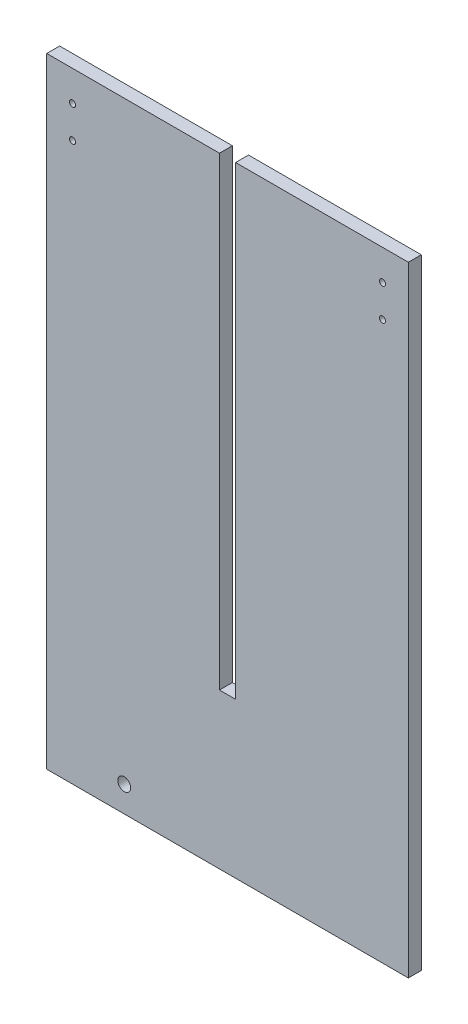
ISO-10303-21;
HEADER;
FILE_DESCRIPTION(('STEP AP214'),'2;1');
FILE_NAME('part.step','',(''),(''),'','','');
FILE_SCHEMA(('AUTOMOTIVE_DESIGN { 1 0 10303 214 1 1 1 1 }'));
ENDSEC;
DATA;
#1=APPLICATION_CONTEXT('core data for automotive mechanical design processes');
#2=APPLICATION_PROTOCOL_DEFINITION('international standard','automotive_design',2000,#1);
#3=PRODUCT_CONTEXT('',#1,'mechanical');
#4=PRODUCT('Part','Part','',(#3));
#5=PRODUCT_RELATED_PRODUCT_CATEGORY('part','',(#4));
#6=PRODUCT_DEFINITION_FORMATION('','',#4);
#7=PRODUCT_DEFINITION_CONTEXT('part definition',#1,'design');
#8=PRODUCT_DEFINITION('design','',#6,#7);
#9=PRODUCT_DEFINITION_SHAPE('','',#8);
#10=(LENGTH_UNIT() NAMED_UNIT(*) SI_UNIT(.MILLI.,.METRE.));
#11=(NAMED_UNIT(*) PLANE_ANGLE_UNIT() SI_UNIT($,.RADIAN.));
#12=(NAMED_UNIT(*) SI_UNIT($,.STERADIAN.) SOLID_ANGLE_UNIT());
#13=UNCERTAINTY_MEASURE_WITH_UNIT(LENGTH_MEASURE(1.E-05),#10,'distance_accuracy_value','');
#14=(GEOMETRIC_REPRESENTATION_CONTEXT(3) GLOBAL_UNCERTAINTY_ASSIGNED_CONTEXT((#13)) GLOBAL_UNIT_ASSIGNED_CONTEXT((#10,
#11,#12)) REPRESENTATION_CONTEXT('',''));
#15=CARTESIAN_POINT('',(0.,0.,0.));
#16=DIRECTION('',(0.,0.,1.));
#17=DIRECTION('',(1.,0.,0.));
#18=AXIS2_PLACEMENT_3D('',#15,#16,#17);
#19=CARTESIAN_POINT('',(0.,152.4,6.35));
#20=DIRECTION('',(0.,1.,0.));
#21=DIRECTION('',(0.,0.,1.));
#22=AXIS2_PLACEMENT_3D('',#19,#20,#21);
#23=PLANE('',#22);
#24=DIRECTION('',(0.,0.,1.));
#25=VECTOR('',#24,1.);
#26=CARTESIAN_POINT('',(-3.96875000000001,152.4,0.));
#27=LINE('',#26,#25);
#28=CARTESIAN_POINT('',(-3.96875000000001,152.4,0.));
#29=VERTEX_POINT('',#28);
#30=CARTESIAN_POINT('',(-3.96875000000001,152.4,6.35));
#31=VERTEX_POINT('',#30);
#32=EDGE_CURVE('E202',#29,#31,#27,.T.);
#33=ORIENTED_EDGE('',*,*,#32,.F.);
#34=DIRECTION('',(1.,0.,0.));
#35=VECTOR('',#34,1.);
#36=CARTESIAN_POINT('',(0.,152.4,0.));
#37=LINE('',#36,#35);
#38=CARTESIAN_POINT('',(-88.9,152.4,0.));
#39=VERTEX_POINT('',#38);
#40=EDGE_CURVE('E225',#39,#29,#37,.T.);
#41=ORIENTED_EDGE('',*,*,#40,.F.);
#42=DIRECTION('',(0.,0.,-1.));
#43=VECTOR('',#42,1.);
#44=CARTESIAN_POINT('',(-88.9,152.4,6.35));
#45=LINE('',#44,#43);
#46=CARTESIAN_POINT('',(-88.9,152.4,6.35));
#47=VERTEX_POINT('',#46);
#48=EDGE_CURVE('E52',#47,#39,#45,.T.);
#49=ORIENTED_EDGE('',*,*,#48,.F.);
#50=DIRECTION('',(1.,0.,0.));
#51=VECTOR('',#50,1.);
#52=CARTESIAN_POINT('',(0.,152.4,6.35));
#53=LINE('',#52,#51);
#54=EDGE_CURVE('E117',#47,#31,#53,.T.);
#55=ORIENTED_EDGE('',*,*,#54,.T.);
#56=EDGE_LOOP('',(#33,#41,#49,#55));
#57=FACE_BOUND('',#56,.T.);
#58=ADVANCED_FACE('F43',(#57),#23,.T.);
#59=CARTESIAN_POINT('',(88.9,0.,6.35));
#60=DIRECTION('',(1.,0.,0.));
#61=DIRECTION('',(0.,0.,-1.));
#62=AXIS2_PLACEMENT_3D('',#59,#60,#61);
#63=PLANE('',#62);
#64=DIRECTION('',(0.,-1.,0.));
#65=VECTOR('',#64,1.);
#66=CARTESIAN_POINT('',(88.9,0.,0.));
#67=LINE('',#66,#65);
#68=CARTESIAN_POINT('',(88.9,152.4,0.));
#69=VERTEX_POINT('',#68);
#70=CARTESIAN_POINT('',(88.9000000000028,-152.4,0.));
#71=VERTEX_POINT('',#70);
#72=EDGE_CURVE('E205',#69,#71,#67,.T.);
#73=ORIENTED_EDGE('',*,*,#72,.F.);
#74=DIRECTION('',(0.,0.,-1.));
#75=VECTOR('',#74,1.);
#76=CARTESIAN_POINT('',(88.9,152.4,6.35));
#77=LINE('',#76,#75);
#78=CARTESIAN_POINT('',(88.9,152.4,6.35));
#79=VERTEX_POINT('',#78);
#80=EDGE_CURVE('E11',#79,#69,#77,.T.);
#81=ORIENTED_EDGE('',*,*,#80,.F.);
#82=DIRECTION('',(0.,-1.,0.));
#83=VECTOR('',#82,1.);
#84=CARTESIAN_POINT('',(88.9,0.,6.35));
#85=LINE('',#84,#83);
#86=CARTESIAN_POINT('',(88.9000000000028,-152.4,6.34999999999999));
#87=VERTEX_POINT('',#86);
#88=EDGE_CURVE('E131',#79,#87,#85,.T.);
#89=ORIENTED_EDGE('',*,*,#88,.T.);
#90=DIRECTION('',(0.,0.,-1.));
#91=VECTOR('',#90,1.);
#92=CARTESIAN_POINT('',(88.9000000000028,-152.4,228.690695780147));
#93=LINE('',#92,#91);
#94=EDGE_CURVE('E128',#87,#71,#93,.T.);
#95=ORIENTED_EDGE('',*,*,#94,.T.);
#96=EDGE_LOOP('',(#73,#81,#89,#95));
#97=FACE_BOUND('',#96,.T.);
#98=ADVANCED_FACE('F45',(#97),#63,.T.);
#99=DIRECTION('',(0.,0.,1.));
#100=VECTOR('',#99,1.);
#101=CARTESIAN_POINT('',(3.96874999999998,152.4,0.));
#102=LINE('',#101,#100);
#103=CARTESIAN_POINT('',(3.96874999999998,152.4,0.));
#104=VERTEX_POINT('',#103);
#105=CARTESIAN_POINT('',(3.96874999999998,152.4,6.35));
#106=VERTEX_POINT('',#105);
#107=EDGE_CURVE('E206',#104,#106,#102,.T.);
#108=ORIENTED_EDGE('',*,*,#107,.T.);
#109=EDGE_CURVE('E217',#106,#79,#53,.T.);
#110=ORIENTED_EDGE('',*,*,#109,.T.);
#111=ORIENTED_EDGE('',*,*,#80,.T.);
#112=EDGE_CURVE('E224',#104,#69,#37,.T.);
#113=ORIENTED_EDGE('',*,*,#112,.F.);
#114=EDGE_LOOP('',(#108,#110,#111,#113));
#115=FACE_BOUND('',#114,.T.);
#116=ADVANCED_FACE('F248',(#115),#23,.T.);
#117=CARTESIAN_POINT('',(-88.8999999999972,0.,6.35));
#118=DIRECTION('',(1.,0.,0.));
#119=DIRECTION('',(0.,0.,-1.));
#120=AXIS2_PLACEMENT_3D('',#117,#118,#119);
#121=PLANE('',#120);
#122=DIRECTION('',(0.,-1.,0.));
#123=VECTOR('',#122,1.);
#124=CARTESIAN_POINT('',(-88.8999999999972,0.,0.));
#125=LINE('',#124,#123);
#126=CARTESIAN_POINT('',(-88.8999999999972,-152.4,0.));
#127=VERTEX_POINT('',#126);
#128=EDGE_CURVE('E134',#39,#127,#125,.T.);
#129=ORIENTED_EDGE('',*,*,#128,.T.);
#130=DIRECTION('',(0.,0.,-1.));
#131=VECTOR('',#130,1.);
#132=CARTESIAN_POINT('',(-88.8999999999972,-152.4,228.690695780147));
#133=LINE('',#132,#131);
#134=CARTESIAN_POINT('',(-88.8999999999972,-152.4,6.34999999999999));
#135=VERTEX_POINT('',#134);
#136=EDGE_CURVE('E125',#135,#127,#133,.T.);
#137=ORIENTED_EDGE('',*,*,#136,.F.);
#138=DIRECTION('',(0.,-1.,0.));
#139=VECTOR('',#138,1.);
#140=CARTESIAN_POINT('',(-88.9,0.,6.35));
#141=LINE('',#140,#139);
#142=EDGE_CURVE('E109',#47,#135,#141,.T.);
#143=ORIENTED_EDGE('',*,*,#142,.F.);
#144=ORIENTED_EDGE('',*,*,#48,.T.);
#145=EDGE_LOOP('',(#129,#137,#143,#144));
#146=FACE_BOUND('',#145,.T.);
#147=ADVANCED_FACE('F133',(#146),#121,.F.);
#148=CARTESIAN_POINT('',(0.,-152.4,6.35));
#149=DIRECTION('',(0.,1.,0.));
#150=DIRECTION('',(0.,0.,1.));
#151=AXIS2_PLACEMENT_3D('',#148,#149,#150);
#152=PLANE('',#151);
#153=DIRECTION('',(1.,0.,0.));
#154=VECTOR('',#153,1.);
#155=CARTESIAN_POINT('',(0.,-152.4,0.));
#156=LINE('',#155,#154);
#157=EDGE_CURVE('E59',#127,#71,#156,.T.);
#158=ORIENTED_EDGE('',*,*,#157,.T.);
#159=ORIENTED_EDGE('',*,*,#94,.F.);
#160=DIRECTION('',(1.,0.,0.));
#161=VECTOR('',#160,1.);
#162=CARTESIAN_POINT('',(0.,-152.4,6.35));
#163=LINE('',#162,#161);
#164=EDGE_CURVE('E113',#135,#87,#163,.T.);
#165=ORIENTED_EDGE('',*,*,#164,.F.);
#166=ORIENTED_EDGE('',*,*,#136,.T.);
#167=EDGE_LOOP('',(#158,#159,#165,#166));
#168=FACE_BOUND('',#167,.T.);
#169=ADVANCED_FACE('F124',(#168),#152,.F.);
#170=CARTESIAN_POINT('',(0.,0.,6.35));
#171=DIRECTION('',(0.,0.,1.));
#172=DIRECTION('',(1.,0.,0.));
#173=AXIS2_PLACEMENT_3D('',#170,#171,#172);
#174=PLANE('',#173);
#175=ORIENTED_EDGE('',*,*,#142,.T.);
#176=ORIENTED_EDGE('',*,*,#164,.T.);
#177=ORIENTED_EDGE('',*,*,#88,.F.);
#178=ORIENTED_EDGE('',*,*,#109,.F.);
#179=DIRECTION('',(0.,1.,0.));
#180=VECTOR('',#179,1.);
#181=CARTESIAN_POINT('',(3.96874999999998,152.4,6.35));
#182=LINE('',#181,#180);
#183=CARTESIAN_POINT('',(3.96875000000001,-76.2,6.35));
#184=VERTEX_POINT('',#183);
#185=EDGE_CURVE('E186',#184,#106,#182,.T.);
#186=ORIENTED_EDGE('',*,*,#185,.F.);
#187=DIRECTION('',(1.,0.,0.));
#188=VECTOR('',#187,1.);
#189=CARTESIAN_POINT('',(-3.96874999999999,-76.2,6.35));
#190=LINE('',#189,#188);
#191=CARTESIAN_POINT('',(-3.96874999999999,-76.2,6.35));
#192=VERTEX_POINT('',#191);
#193=EDGE_CURVE('E196',#192,#184,#190,.T.);
#194=ORIENTED_EDGE('',*,*,#193,.F.);
#195=DIRECTION('',(0.,-1.,0.));
#196=VECTOR('',#195,1.);
#197=CARTESIAN_POINT('',(-3.96875000000001,152.4,6.35));
#198=LINE('',#197,#196);
#199=EDGE_CURVE('E177',#31,#192,#198,.T.);
#200=ORIENTED_EDGE('',*,*,#199,.F.);
#201=ORIENTED_EDGE('',*,*,#54,.F.);
#202=EDGE_LOOP('',(#175,#176,#177,#178,#186,#194,#200,#201));
#203=FACE_BOUND('',#202,.T.);
#204=CARTESIAN_POINT('',(76.2,137.4,6.35));
#205=DIRECTION('',(0.,0.,1.));
#206=DIRECTION('',(-1.,0.,0.));
#207=AXIS2_PLACEMENT_3D('',#204,#205,#206);
#208=CIRCLE('',#207,1.50000000000001);
#209=CARTESIAN_POINT('',(74.7,137.4,6.35));
#210=VERTEX_POINT('',#209);
#211=EDGE_CURVE('E138',#210,#210,#208,.T.);
#212=ORIENTED_EDGE('',*,*,#211,.F.);
#213=EDGE_LOOP('',(#212));
#214=FACE_BOUND('',#213,.T.);
#215=CARTESIAN_POINT('',(76.2,121.65,6.35));
#216=DIRECTION('',(0.,0.,1.));
#217=DIRECTION('',(-1.,0.,0.));
#218=AXIS2_PLACEMENT_3D('',#215,#216,#217);
#219=CIRCLE('',#218,1.5);
#220=CARTESIAN_POINT('',(74.7,121.65,6.35));
#221=VERTEX_POINT('',#220);
#222=EDGE_CURVE('E151',#221,#221,#219,.T.);
#223=ORIENTED_EDGE('',*,*,#222,.F.);
#224=EDGE_LOOP('',(#223));
#225=FACE_BOUND('',#224,.T.);
#226=CARTESIAN_POINT('',(-76.2,121.65,6.35));
#227=DIRECTION('',(0.,0.,1.));
#228=DIRECTION('',(1.,0.,0.));
#229=AXIS2_PLACEMENT_3D('',#226,#227,#228);
#230=CIRCLE('',#229,1.5);
#231=CARTESIAN_POINT('',(-74.7,121.65,6.35));
#232=VERTEX_POINT('',#231);
#233=EDGE_CURVE('E141',#232,#232,#230,.T.);
#234=ORIENTED_EDGE('',*,*,#233,.F.);
#235=EDGE_LOOP('',(#234));
#236=FACE_BOUND('',#235,.T.);
#237=CARTESIAN_POINT('',(-76.2,137.4,6.35));
#238=DIRECTION('',(0.,0.,1.));
#239=DIRECTION('',(1.,0.,0.));
#240=AXIS2_PLACEMENT_3D('',#237,#238,#239);
#241=CIRCLE('',#240,1.50000000000001);
#242=CARTESIAN_POINT('',(-74.7,137.4,6.35));
#243=VERTEX_POINT('',#242);
#244=EDGE_CURVE('E150',#243,#243,#241,.T.);
#245=ORIENTED_EDGE('',*,*,#244,.F.);
#246=EDGE_LOOP('',(#245));
#247=FACE_BOUND('',#246,.T.);
#248=CARTESIAN_POINT('',(-50.8,-139.7,6.35));
#249=DIRECTION('',(0.,0.,1.));
#250=DIRECTION('',(1.,0.,0.));
#251=AXIS2_PLACEMENT_3D('',#248,#249,#250);
#252=CIRCLE('',#251,3.175);
#253=CARTESIAN_POINT('',(-47.625,-139.7,6.35));
#254=VERTEX_POINT('',#253);
#255=EDGE_CURVE('E172',#254,#254,#252,.T.);
#256=ORIENTED_EDGE('',*,*,#255,.F.);
#257=EDGE_LOOP('',(#256));
#258=FACE_BOUND('',#257,.T.);
#259=ADVANCED_FACE('F111',(#203,#214,#225,#236,#247,#258),#174,.T.);
#260=CARTESIAN_POINT('',(0.,0.,0.));
#261=DIRECTION('',(0.,0.,1.));
#262=DIRECTION('',(1.,0.,0.));
#263=AXIS2_PLACEMENT_3D('',#260,#261,#262);
#264=PLANE('',#263);
#265=ORIENTED_EDGE('',*,*,#128,.F.);
#266=ORIENTED_EDGE('',*,*,#40,.T.);
#267=DIRECTION('',(0.,-1.,0.));
#268=VECTOR('',#267,1.);
#269=CARTESIAN_POINT('',(-3.96875000000001,152.4,0.));
#270=LINE('',#269,#268);
#271=CARTESIAN_POINT('',(-3.96874999999999,-76.2,0.));
#272=VERTEX_POINT('',#271);
#273=EDGE_CURVE('E181',#29,#272,#270,.T.);
#274=ORIENTED_EDGE('',*,*,#273,.T.);
#275=DIRECTION('',(1.,0.,0.));
#276=VECTOR('',#275,1.);
#277=CARTESIAN_POINT('',(-3.96874999999999,-76.2,0.));
#278=LINE('',#277,#276);
#279=CARTESIAN_POINT('',(3.96875000000001,-76.2,0.));
#280=VERTEX_POINT('',#279);
#281=EDGE_CURVE('E185',#272,#280,#278,.T.);
#282=ORIENTED_EDGE('',*,*,#281,.T.);
#283=DIRECTION('',(0.,1.,0.));
#284=VECTOR('',#283,1.);
#285=CARTESIAN_POINT('',(3.96874999999998,152.4,0.));
#286=LINE('',#285,#284);
#287=EDGE_CURVE('E67',#280,#104,#286,.T.);
#288=ORIENTED_EDGE('',*,*,#287,.T.);
#289=ORIENTED_EDGE('',*,*,#112,.T.);
#290=ORIENTED_EDGE('',*,*,#72,.T.);
#291=ORIENTED_EDGE('',*,*,#157,.F.);
#292=EDGE_LOOP('',(#265,#266,#274,#282,#288,#289,#290,#291));
#293=FACE_BOUND('',#292,.T.);
#294=CARTESIAN_POINT('',(76.2,137.4,0.));
#295=DIRECTION('',(0.,0.,1.));
#296=DIRECTION('',(1.,0.,0.));
#297=AXIS2_PLACEMENT_3D('',#294,#295,#296);
#298=CIRCLE('',#297,1.50000000000001);
#299=CARTESIAN_POINT('',(77.7,137.4,0.));
#300=VERTEX_POINT('',#299);
#301=EDGE_CURVE('E155',#300,#300,#298,.F.);
#302=ORIENTED_EDGE('',*,*,#301,.F.);
#303=EDGE_LOOP('',(#302));
#304=FACE_BOUND('',#303,.T.);
#305=CARTESIAN_POINT('',(76.2,121.65,0.));
#306=DIRECTION('',(0.,0.,1.));
#307=DIRECTION('',(1.,0.,0.));
#308=AXIS2_PLACEMENT_3D('',#305,#306,#307);
#309=CIRCLE('',#308,1.5);
#310=CARTESIAN_POINT('',(77.7,121.65,0.));
#311=VERTEX_POINT('',#310);
#312=EDGE_CURVE('E146',#311,#311,#309,.F.);
#313=ORIENTED_EDGE('',*,*,#312,.F.);
#314=EDGE_LOOP('',(#313));
#315=FACE_BOUND('',#314,.T.);
#316=CARTESIAN_POINT('',(-76.2,121.65,0.));
#317=DIRECTION('',(0.,0.,1.));
#318=DIRECTION('',(1.,0.,0.));
#319=AXIS2_PLACEMENT_3D('',#316,#317,#318);
#320=CIRCLE('',#319,1.5);
#321=CARTESIAN_POINT('',(-74.7,121.65,0.));
#322=VERTEX_POINT('',#321);
#323=EDGE_CURVE('E145',#322,#322,#320,.F.);
#324=ORIENTED_EDGE('',*,*,#323,.F.);
#325=EDGE_LOOP('',(#324));
#326=FACE_BOUND('',#325,.T.);
#327=CARTESIAN_POINT('',(-76.2,137.4,0.));
#328=DIRECTION('',(0.,0.,1.));
#329=DIRECTION('',(1.,0.,0.));
#330=AXIS2_PLACEMENT_3D('',#327,#328,#329);
#331=CIRCLE('',#330,1.50000000000001);
#332=CARTESIAN_POINT('',(-74.7,137.4,0.));
#333=VERTEX_POINT('',#332);
#334=EDGE_CURVE('E168',#333,#333,#331,.F.);
#335=ORIENTED_EDGE('',*,*,#334,.F.);
#336=EDGE_LOOP('',(#335));
#337=FACE_BOUND('',#336,.T.);
#338=CARTESIAN_POINT('',(-50.8,-139.7,0.));
#339=DIRECTION('',(0.,0.,1.));
#340=DIRECTION('',(1.,0.,0.));
#341=AXIS2_PLACEMENT_3D('',#338,#339,#340);
#342=CIRCLE('',#341,3.175);
#343=CARTESIAN_POINT('',(-47.625,-139.7,0.));
#344=VERTEX_POINT('',#343);
#345=EDGE_CURVE('E173',#344,#344,#342,.T.);
#346=ORIENTED_EDGE('',*,*,#345,.T.);
#347=EDGE_LOOP('',(#346));
#348=FACE_BOUND('',#347,.T.);
#349=ADVANCED_FACE('F234',(#293,#304,#315,#326,#337,#348),#264,.F.);
#350=CARTESIAN_POINT('',(-3.96875000000001,152.4,0.));
#351=DIRECTION('',(-1.,0.,0.));
#352=DIRECTION('',(0.,-1.,0.));
#353=AXIS2_PLACEMENT_3D('',#350,#351,#352);
#354=PLANE('',#353);
#355=ORIENTED_EDGE('',*,*,#199,.T.);
#356=DIRECTION('',(0.,0.,1.));
#357=VECTOR('',#356,1.);
#358=CARTESIAN_POINT('',(-3.96874999999999,-76.2,0.));
#359=LINE('',#358,#357);
#360=EDGE_CURVE('E192',#272,#192,#359,.T.);
#361=ORIENTED_EDGE('',*,*,#360,.F.);
#362=ORIENTED_EDGE('',*,*,#273,.F.);
#363=ORIENTED_EDGE('',*,*,#32,.T.);
#364=EDGE_LOOP('',(#355,#361,#362,#363));
#365=FACE_BOUND('',#364,.T.);
#366=ADVANCED_FACE('F238',(#365),#354,.F.);
#367=CARTESIAN_POINT('',(3.96874999999998,152.4,0.));
#368=DIRECTION('',(1.,0.,0.));
#369=DIRECTION('',(0.,1.,0.));
#370=AXIS2_PLACEMENT_3D('',#367,#368,#369);
#371=PLANE('',#370);
#372=ORIENTED_EDGE('',*,*,#185,.T.);
#373=ORIENTED_EDGE('',*,*,#107,.F.);
#374=ORIENTED_EDGE('',*,*,#287,.F.);
#375=DIRECTION('',(0.,0.,1.));
#376=VECTOR('',#375,1.);
#377=CARTESIAN_POINT('',(3.96875000000001,-76.2,0.));
#378=LINE('',#377,#376);
#379=EDGE_CURVE('E210',#280,#184,#378,.T.);
#380=ORIENTED_EDGE('',*,*,#379,.T.);
#381=EDGE_LOOP('',(#372,#373,#374,#380));
#382=FACE_BOUND('',#381,.T.);
#383=ADVANCED_FACE('F243',(#382),#371,.F.);
#384=CARTESIAN_POINT('',(-3.96874999999999,-76.2,0.));
#385=DIRECTION('',(0.,-1.,0.));
#386=DIRECTION('',(0.,0.,-1.));
#387=AXIS2_PLACEMENT_3D('',#384,#385,#386);
#388=PLANE('',#387);
#389=ORIENTED_EDGE('',*,*,#193,.T.);
#390=ORIENTED_EDGE('',*,*,#379,.F.);
#391=ORIENTED_EDGE('',*,*,#281,.F.);
#392=ORIENTED_EDGE('',*,*,#360,.T.);
#393=EDGE_LOOP('',(#389,#390,#391,#392));
#394=FACE_BOUND('',#393,.T.);
#395=ADVANCED_FACE('F241',(#394),#388,.F.);
#396=CARTESIAN_POINT('',(-50.8,-139.7,0.));
#397=DIRECTION('',(0.,0.,1.));
#398=DIRECTION('',(1.,0.,0.));
#399=AXIS2_PLACEMENT_3D('',#396,#397,#398);
#400=CYLINDRICAL_SURFACE('',#399,3.175);
#401=ORIENTED_EDGE('',*,*,#345,.F.);
#402=EDGE_LOOP('',(#401));
#403=FACE_BOUND('',#402,.T.);
#404=ORIENTED_EDGE('',*,*,#255,.T.);
#405=EDGE_LOOP('',(#404));
#406=FACE_BOUND('',#405,.T.);
#407=ADVANCED_FACE('F274',(#403,#406),#400,.F.);
#408=CARTESIAN_POINT('',(-76.2,137.4,-4.24264068711931));
#409=DIRECTION('',(0.,0.,1.));
#410=DIRECTION('',(1.,0.,0.));
#411=AXIS2_PLACEMENT_3D('',#408,#409,#410);
#412=CYLINDRICAL_SURFACE('',#411,1.50000000000001);
#413=ORIENTED_EDGE('',*,*,#334,.T.);
#414=EDGE_LOOP('',(#413));
#415=FACE_BOUND('',#414,.T.);
#416=ORIENTED_EDGE('',*,*,#244,.T.);
#417=EDGE_LOOP('',(#416));
#418=FACE_BOUND('',#417,.T.);
#419=ADVANCED_FACE('F279',(#415,#418),#412,.F.);
#420=CARTESIAN_POINT('',(-76.2,121.65,-4.24264068711931));
#421=DIRECTION('',(0.,0.,1.));
#422=DIRECTION('',(1.,0.,0.));
#423=AXIS2_PLACEMENT_3D('',#420,#421,#422);
#424=CYLINDRICAL_SURFACE('',#423,1.5);
#425=ORIENTED_EDGE('',*,*,#323,.T.);
#426=EDGE_LOOP('',(#425));
#427=FACE_BOUND('',#426,.T.);
#428=ORIENTED_EDGE('',*,*,#233,.T.);
#429=EDGE_LOOP('',(#428));
#430=FACE_BOUND('',#429,.T.);
#431=ADVANCED_FACE('F283',(#427,#430),#424,.F.);
#432=CARTESIAN_POINT('',(76.2,121.65,-4.24264068711931));
#433=DIRECTION('',(0.,0.,1.));
#434=DIRECTION('',(1.,0.,0.));
#435=AXIS2_PLACEMENT_3D('',#432,#433,#434);
#436=CYLINDRICAL_SURFACE('',#435,1.5);
#437=ORIENTED_EDGE('',*,*,#312,.T.);
#438=EDGE_LOOP('',(#437));
#439=FACE_BOUND('',#438,.T.);
#440=ORIENTED_EDGE('',*,*,#222,.T.);
#441=EDGE_LOOP('',(#440));
#442=FACE_BOUND('',#441,.T.);
#443=ADVANCED_FACE('F288',(#439,#442),#436,.F.);
#444=CARTESIAN_POINT('',(76.2,137.4,-4.24264068711931));
#445=DIRECTION('',(0.,0.,1.));
#446=DIRECTION('',(1.,0.,0.));
#447=AXIS2_PLACEMENT_3D('',#444,#445,#446);
#448=CYLINDRICAL_SURFACE('',#447,1.50000000000001);
#449=ORIENTED_EDGE('',*,*,#301,.T.);
#450=EDGE_LOOP('',(#449));
#451=FACE_BOUND('',#450,.T.);
#452=ORIENTED_EDGE('',*,*,#211,.T.);
#453=EDGE_LOOP('',(#452));
#454=FACE_BOUND('',#453,.T.);
#455=ADVANCED_FACE('F285',(#451,#454),#448,.F.);
#456=CLOSED_SHELL('',(#58,#98,#116,#147,#169,#259,#349,#366,#383,#395,#407,#419,#431,#443,#455));
#457=MANIFOLD_SOLID_BREP('B2',#456);
#458=ADVANCED_BREP_SHAPE_REPRESENTATION('',(#18,#457),#14);
#459=SHAPE_DEFINITION_REPRESENTATION(#9,#458);
ENDSEC;
END-ISO-10303-21;
